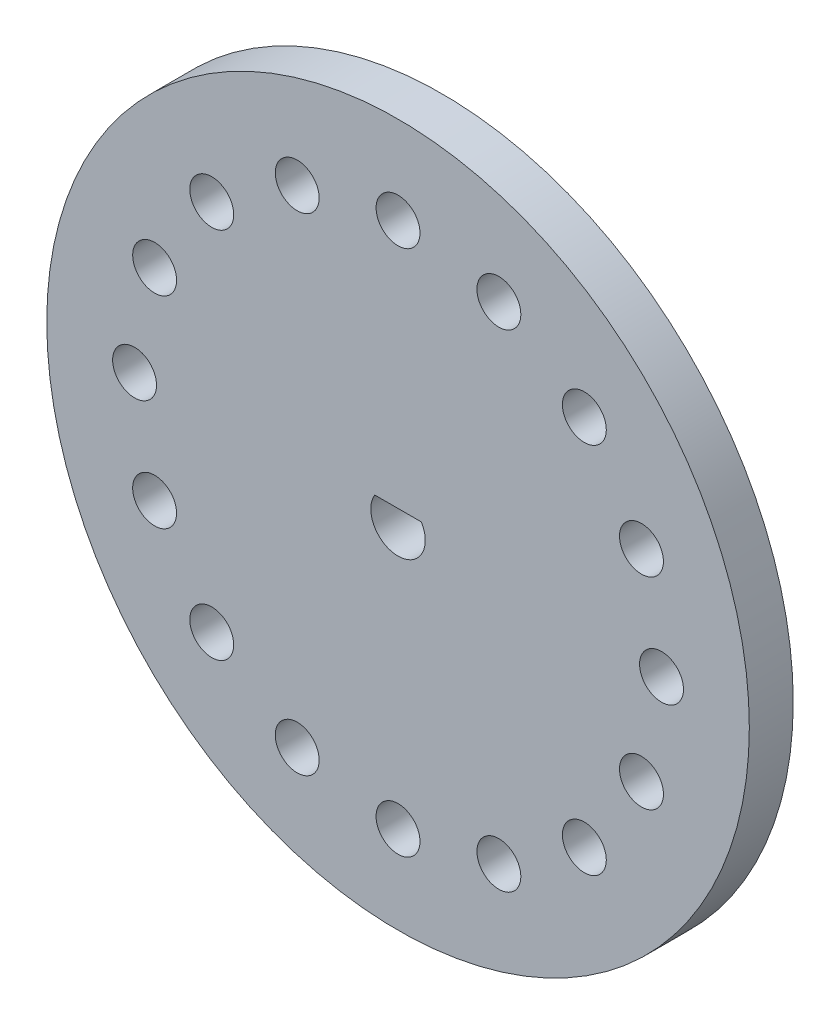
ISO-10303-21;
HEADER;
FILE_DESCRIPTION(('STEP AP214'),'2;1');
FILE_NAME('part.step','',(''),(''),'','','');
FILE_SCHEMA(('AUTOMOTIVE_DESIGN { 1 0 10303 214 1 1 1 1 }'));
ENDSEC;
DATA;
#1=APPLICATION_CONTEXT('core data for automotive mechanical design processes');
#2=APPLICATION_PROTOCOL_DEFINITION('international standard','automotive_design',2000,#1);
#3=PRODUCT_CONTEXT('',#1,'mechanical');
#4=PRODUCT('Part','Part','',(#3));
#5=PRODUCT_RELATED_PRODUCT_CATEGORY('part','',(#4));
#6=PRODUCT_DEFINITION_FORMATION('','',#4);
#7=PRODUCT_DEFINITION_CONTEXT('part definition',#1,'design');
#8=PRODUCT_DEFINITION('design','',#6,#7);
#9=PRODUCT_DEFINITION_SHAPE('','',#8);
#10=(LENGTH_UNIT() NAMED_UNIT(*) SI_UNIT(.MILLI.,.METRE.));
#11=(NAMED_UNIT(*) PLANE_ANGLE_UNIT() SI_UNIT($,.RADIAN.));
#12=(NAMED_UNIT(*) SI_UNIT($,.STERADIAN.) SOLID_ANGLE_UNIT());
#13=UNCERTAINTY_MEASURE_WITH_UNIT(LENGTH_MEASURE(1.E-05),#10,'distance_accuracy_value','');
#14=(GEOMETRIC_REPRESENTATION_CONTEXT(3) GLOBAL_UNCERTAINTY_ASSIGNED_CONTEXT((#13)) GLOBAL_UNIT_ASSIGNED_CONTEXT((#10,
#11,#12)) REPRESENTATION_CONTEXT('',''));
#15=CARTESIAN_POINT('',(0.,0.,0.));
#16=DIRECTION('',(0.,0.,1.));
#17=DIRECTION('',(1.,0.,0.));
#18=AXIS2_PLACEMENT_3D('',#15,#16,#17);
#19=CARTESIAN_POINT('',(0.,0.,-5.));
#20=DIRECTION('',(0.,0.,1.));
#21=DIRECTION('',(1.,0.,0.));
#22=AXIS2_PLACEMENT_3D('',#19,#20,#21);
#23=CYLINDRICAL_SURFACE('',#22,40.);
#24=CARTESIAN_POINT('',(0.,0.,-5.));
#25=DIRECTION('',(0.,0.,1.));
#26=DIRECTION('',(1.,0.,0.));
#27=AXIS2_PLACEMENT_3D('',#24,#25,#26);
#28=CIRCLE('',#27,40.);
#29=CARTESIAN_POINT('',(40.,0.,-5.));
#30=VERTEX_POINT('',#29);
#31=EDGE_CURVE('E11',#30,#30,#28,.T.);
#32=ORIENTED_EDGE('',*,*,#31,.T.);
#33=EDGE_LOOP('',(#32));
#34=FACE_BOUND('',#33,.T.);
#35=CARTESIAN_POINT('',(0.,0.,0.));
#36=DIRECTION('',(0.,0.,1.));
#37=DIRECTION('',(1.,0.,0.));
#38=AXIS2_PLACEMENT_3D('',#35,#36,#37);
#39=CIRCLE('',#38,40.);
#40=CARTESIAN_POINT('',(40.,0.,0.));
#41=VERTEX_POINT('',#40);
#42=EDGE_CURVE('E44',#41,#41,#39,.T.);
#43=ORIENTED_EDGE('',*,*,#42,.F.);
#44=EDGE_LOOP('',(#43));
#45=FACE_BOUND('',#44,.T.);
#46=ADVANCED_FACE('F41',(#34,#45),#23,.T.);
#47=CARTESIAN_POINT('',(0.,0.,-5.));
#48=DIRECTION('',(0.,0.,1.));
#49=DIRECTION('',(1.,0.,0.));
#50=AXIS2_PLACEMENT_3D('',#47,#48,#49);
#51=PLANE('',#50);
#52=CARTESIAN_POINT('',(-21.2132034355965,21.2132034355964,-5.));
#53=DIRECTION('',(0.,0.,1.));
#54=DIRECTION('',(1.,0.,0.));
#55=AXIS2_PLACEMENT_3D('',#52,#53,#54);
#56=CIRCLE('',#55,2.5);
#57=CARTESIAN_POINT('',(-18.7132034355965,21.2132034355964,-5.));
#58=VERTEX_POINT('',#57);
#59=EDGE_CURVE('E99',#58,#58,#56,.F.);
#60=ORIENTED_EDGE('',*,*,#59,.F.);
#61=EDGE_LOOP('',(#60));
#62=FACE_BOUND('',#61,.T.);
#63=CARTESIAN_POINT('',(-27.7163859753386,11.4805029709526,-5.));
#64=DIRECTION('',(0.,0.,1.));
#65=DIRECTION('',(1.,0.,0.));
#66=AXIS2_PLACEMENT_3D('',#63,#64,#65);
#67=CIRCLE('',#66,2.5);
#68=CARTESIAN_POINT('',(-25.2163859753386,11.4805029709526,-5.));
#69=VERTEX_POINT('',#68);
#70=EDGE_CURVE('E138',#69,#69,#67,.F.);
#71=ORIENTED_EDGE('',*,*,#70,.F.);
#72=EDGE_LOOP('',(#71));
#73=FACE_BOUND('',#72,.T.);
#74=CARTESIAN_POINT('',(-30.,-1.04744440165294E-13,-5.));
#75=DIRECTION('',(0.,0.,1.));
#76=DIRECTION('',(1.,0.,0.));
#77=AXIS2_PLACEMENT_3D('',#74,#75,#76);
#78=CIRCLE('',#77,2.5);
#79=CARTESIAN_POINT('',(-27.5,-1.04744440165294E-13,-5.));
#80=VERTEX_POINT('',#79);
#81=EDGE_CURVE('E132',#80,#80,#78,.F.);
#82=ORIENTED_EDGE('',*,*,#81,.F.);
#83=EDGE_LOOP('',(#82));
#84=FACE_BOUND('',#83,.T.);
#85=CARTESIAN_POINT('',(-27.7163859753386,-11.4805029709528,-5.));
#86=DIRECTION('',(0.,0.,1.));
#87=DIRECTION('',(1.,0.,0.));
#88=AXIS2_PLACEMENT_3D('',#85,#86,#87);
#89=CIRCLE('',#88,2.5);
#90=CARTESIAN_POINT('',(-25.2163859753386,-11.4805029709528,-5.));
#91=VERTEX_POINT('',#90);
#92=EDGE_CURVE('E126',#91,#91,#89,.F.);
#93=ORIENTED_EDGE('',*,*,#92,.F.);
#94=EDGE_LOOP('',(#93));
#95=FACE_BOUND('',#94,.T.);
#96=CARTESIAN_POINT('',(-21.2132034355963,-21.2132034355965,-5.));
#97=DIRECTION('',(0.,0.,1.));
#98=DIRECTION('',(1.,0.,0.));
#99=AXIS2_PLACEMENT_3D('',#96,#97,#98);
#100=CIRCLE('',#99,2.5);
#101=CARTESIAN_POINT('',(-18.7132034355963,-21.2132034355965,-5.));
#102=VERTEX_POINT('',#101);
#103=EDGE_CURVE('E120',#102,#102,#100,.F.);
#104=ORIENTED_EDGE('',*,*,#103,.F.);
#105=EDGE_LOOP('',(#104));
#106=FACE_BOUND('',#105,.T.);
#107=CARTESIAN_POINT('',(-11.4805029709525,-27.7163859753387,-5.));
#108=DIRECTION('',(0.,0.,1.));
#109=DIRECTION('',(1.,0.,0.));
#110=AXIS2_PLACEMENT_3D('',#107,#108,#109);
#111=CIRCLE('',#110,2.5);
#112=CARTESIAN_POINT('',(-8.98050297095252,-27.7163859753387,-5.));
#113=VERTEX_POINT('',#112);
#114=EDGE_CURVE('E114',#113,#113,#111,.F.);
#115=ORIENTED_EDGE('',*,*,#114,.F.);
#116=EDGE_LOOP('',(#115));
#117=FACE_BOUND('',#116,.T.);
#118=CARTESIAN_POINT('',(0.,-30.,-5.));
#119=DIRECTION('',(0.,0.,1.));
#120=DIRECTION('',(1.,0.,0.));
#121=AXIS2_PLACEMENT_3D('',#118,#119,#120);
#122=CIRCLE('',#121,2.5);
#123=CARTESIAN_POINT('',(2.5,-30.,-5.));
#124=VERTEX_POINT('',#123);
#125=EDGE_CURVE('E108',#124,#124,#122,.F.);
#126=ORIENTED_EDGE('',*,*,#125,.F.);
#127=EDGE_LOOP('',(#126));
#128=FACE_BOUND('',#127,.T.);
#129=CARTESIAN_POINT('',(11.4805029709529,-27.7163859753385,-5.));
#130=DIRECTION('',(0.,0.,1.));
#131=DIRECTION('',(1.,0.,0.));
#132=AXIS2_PLACEMENT_3D('',#129,#130,#131);
#133=CIRCLE('',#132,2.5);
#134=CARTESIAN_POINT('',(13.9805029709529,-27.7163859753385,-5.));
#135=VERTEX_POINT('',#134);
#136=EDGE_CURVE('E100',#135,#135,#133,.F.);
#137=ORIENTED_EDGE('',*,*,#136,.F.);
#138=EDGE_LOOP('',(#137));
#139=FACE_BOUND('',#138,.T.);
#140=CARTESIAN_POINT('',(21.2132034355966,-21.2132034355962,-5.));
#141=DIRECTION('',(0.,0.,1.));
#142=DIRECTION('',(1.,0.,0.));
#143=AXIS2_PLACEMENT_3D('',#140,#141,#142);
#144=CIRCLE('',#143,2.5);
#145=CARTESIAN_POINT('',(23.7132034355966,-21.2132034355962,-5.));
#146=VERTEX_POINT('',#145);
#147=EDGE_CURVE('E107',#146,#146,#144,.F.);
#148=ORIENTED_EDGE('',*,*,#147,.F.);
#149=EDGE_LOOP('',(#148));
#150=FACE_BOUND('',#149,.T.);
#151=CARTESIAN_POINT('',(27.7163859753387,-11.4805029709524,-5.));
#152=DIRECTION('',(0.,0.,1.));
#153=DIRECTION('',(1.,0.,0.));
#154=AXIS2_PLACEMENT_3D('',#151,#152,#153);
#155=CIRCLE('',#154,2.5);
#156=CARTESIAN_POINT('',(30.2163859753387,-11.4805029709524,-5.));
#157=VERTEX_POINT('',#156);
#158=EDGE_CURVE('E173',#157,#157,#155,.F.);
#159=ORIENTED_EDGE('',*,*,#158,.F.);
#160=EDGE_LOOP('',(#159));
#161=FACE_BOUND('',#160,.T.);
#162=CARTESIAN_POINT('',(30.,3.14233320495882E-13,-5.));
#163=DIRECTION('',(0.,0.,1.));
#164=DIRECTION('',(1.,0.,0.));
#165=AXIS2_PLACEMENT_3D('',#162,#163,#164);
#166=CIRCLE('',#165,2.5);
#167=CARTESIAN_POINT('',(32.5,3.14233320495882E-13,-5.));
#168=VERTEX_POINT('',#167);
#169=EDGE_CURVE('E167',#168,#168,#166,.F.);
#170=ORIENTED_EDGE('',*,*,#169,.F.);
#171=EDGE_LOOP('',(#170));
#172=FACE_BOUND('',#171,.T.);
#173=CARTESIAN_POINT('',(27.7163859753385,11.480502970953,-5.));
#174=DIRECTION('',(0.,0.,1.));
#175=DIRECTION('',(1.,0.,0.));
#176=AXIS2_PLACEMENT_3D('',#173,#174,#175);
#177=CIRCLE('',#176,2.5);
#178=CARTESIAN_POINT('',(30.2163859753385,11.480502970953,-5.));
#179=VERTEX_POINT('',#178);
#180=EDGE_CURVE('E161',#179,#179,#177,.F.);
#181=ORIENTED_EDGE('',*,*,#180,.F.);
#182=EDGE_LOOP('',(#181));
#183=FACE_BOUND('',#182,.T.);
#184=CARTESIAN_POINT('',(21.2132034355962,21.2132034355967,-5.));
#185=DIRECTION('',(0.,0.,1.));
#186=DIRECTION('',(1.,0.,0.));
#187=AXIS2_PLACEMENT_3D('',#184,#185,#186);
#188=CIRCLE('',#187,2.5);
#189=CARTESIAN_POINT('',(23.7132034355962,21.2132034355967,-5.));
#190=VERTEX_POINT('',#189);
#191=EDGE_CURVE('E155',#190,#190,#188,.F.);
#192=ORIENTED_EDGE('',*,*,#191,.F.);
#193=EDGE_LOOP('',(#192));
#194=FACE_BOUND('',#193,.T.);
#195=CARTESIAN_POINT('',(11.4805029709523,27.7163859753388,-5.));
#196=DIRECTION('',(0.,0.,1.));
#197=DIRECTION('',(1.,0.,0.));
#198=AXIS2_PLACEMENT_3D('',#195,#196,#197);
#199=CIRCLE('',#198,2.5);
#200=CARTESIAN_POINT('',(13.9805029709523,27.7163859753388,-5.));
#201=VERTEX_POINT('',#200);
#202=EDGE_CURVE('E148',#201,#201,#199,.F.);
#203=ORIENTED_EDGE('',*,*,#202,.F.);
#204=EDGE_LOOP('',(#203));
#205=FACE_BOUND('',#204,.T.);
#206=CARTESIAN_POINT('',(-11.4805029709527,27.7163859753386,-5.));
#207=DIRECTION('',(0.,0.,1.));
#208=DIRECTION('',(1.,0.,0.));
#209=AXIS2_PLACEMENT_3D('',#206,#207,#208);
#210=CIRCLE('',#209,2.5);
#211=CARTESIAN_POINT('',(-8.98050297095272,27.7163859753386,-5.));
#212=VERTEX_POINT('',#211);
#213=EDGE_CURVE('E93',#212,#212,#210,.F.);
#214=ORIENTED_EDGE('',*,*,#213,.F.);
#215=EDGE_LOOP('',(#214));
#216=FACE_BOUND('',#215,.T.);
#217=CARTESIAN_POINT('',(0.,30.,-5.));
#218=DIRECTION('',(0.,0.,1.));
#219=DIRECTION('',(1.,0.,0.));
#220=AXIS2_PLACEMENT_3D('',#217,#218,#219);
#221=CIRCLE('',#220,2.5);
#222=CARTESIAN_POINT('',(2.5,30.,-5.));
#223=VERTEX_POINT('',#222);
#224=EDGE_CURVE('E80',#223,#223,#221,.F.);
#225=ORIENTED_EDGE('',*,*,#224,.F.);
#226=EDGE_LOOP('',(#225));
#227=FACE_BOUND('',#226,.T.);
#228=DIRECTION('',(-1.,0.,0.));
#229=VECTOR('',#228,1.);
#230=CARTESIAN_POINT('',(2.65518360947035,1.6,-5.));
#231=LINE('',#230,#229);
#232=CARTESIAN_POINT('',(2.65518360947035,1.6,-5.));
#233=VERTEX_POINT('',#232);
#234=CARTESIAN_POINT('',(-2.65518360947035,1.6,-5.));
#235=VERTEX_POINT('',#234);
#236=EDGE_CURVE('E86',#233,#235,#231,.T.);
#237=ORIENTED_EDGE('',*,*,#236,.T.);
#238=CARTESIAN_POINT('',(0.,0.,-5.));
#239=DIRECTION('',(0.,0.,1.));
#240=DIRECTION('',(1.,0.,0.));
#241=AXIS2_PLACEMENT_3D('',#238,#239,#240);
#242=CIRCLE('',#241,3.1);
#243=EDGE_CURVE('E55',#235,#233,#242,.T.);
#244=ORIENTED_EDGE('',*,*,#243,.T.);
#245=EDGE_LOOP('',(#237,#244));
#246=FACE_BOUND('',#245,.T.);
#247=ORIENTED_EDGE('',*,*,#31,.F.);
#248=EDGE_LOOP('',(#247));
#249=FACE_BOUND('',#248,.T.);
#250=ADVANCED_FACE('F189',(#62,#73,#84,#95,#106,#117,#128,#139,#150,#161,#172,#183,#194,#205,
#216,#227,#246,#249),#51,.F.);
#251=CARTESIAN_POINT('',(0.,0.,0.));
#252=DIRECTION('',(0.,0.,1.));
#253=DIRECTION('',(1.,0.,0.));
#254=AXIS2_PLACEMENT_3D('',#251,#252,#253);
#255=PLANE('',#254);
#256=CARTESIAN_POINT('',(-21.2132034355965,21.2132034355964,0.));
#257=DIRECTION('',(0.,0.,1.));
#258=DIRECTION('',(0.707106781186546,0.707106781186549,0.));
#259=AXIS2_PLACEMENT_3D('',#256,#257,#258);
#260=CIRCLE('',#259,2.5);
#261=CARTESIAN_POINT('',(-19.4454364826301,22.9809703885628,0.));
#262=VERTEX_POINT('',#261);
#263=EDGE_CURVE('E141',#262,#262,#260,.T.);
#264=ORIENTED_EDGE('',*,*,#263,.F.);
#265=EDGE_LOOP('',(#264));
#266=FACE_BOUND('',#265,.T.);
#267=CARTESIAN_POINT('',(-27.7163859753386,11.4805029709526,0.));
#268=DIRECTION('',(0.,0.,1.));
#269=DIRECTION('',(0.382683432365087,0.923879532511288,0.));
#270=AXIS2_PLACEMENT_3D('',#267,#268,#269);
#271=CIRCLE('',#270,2.5);
#272=CARTESIAN_POINT('',(-26.7596773944259,13.7902018022308,0.));
#273=VERTEX_POINT('',#272);
#274=EDGE_CURVE('E135',#273,#273,#271,.T.);
#275=ORIENTED_EDGE('',*,*,#274,.F.);
#276=EDGE_LOOP('',(#275));
#277=FACE_BOUND('',#276,.T.);
#278=CARTESIAN_POINT('',(-30.,-1.04744440165294E-13,0.));
#279=DIRECTION('',(0.,0.,1.));
#280=DIRECTION('',(0.,1.,0.));
#281=AXIS2_PLACEMENT_3D('',#278,#279,#280);
#282=CIRCLE('',#281,2.5);
#283=CARTESIAN_POINT('',(-30.,2.4999999999999,0.));
#284=VERTEX_POINT('',#283);
#285=EDGE_CURVE('E129',#284,#284,#282,.T.);
#286=ORIENTED_EDGE('',*,*,#285,.F.);
#287=EDGE_LOOP('',(#286));
#288=FACE_BOUND('',#287,.T.);
#289=CARTESIAN_POINT('',(-27.7163859753386,-11.4805029709528,0.));
#290=DIRECTION('',(0.,0.,1.));
#291=DIRECTION('',(-0.382683432365094,0.923879532511285,0.));
#292=AXIS2_PLACEMENT_3D('',#289,#290,#291);
#293=CIRCLE('',#292,2.5);
#294=CARTESIAN_POINT('',(-28.6730945562513,-9.1708041396746,0.));
#295=VERTEX_POINT('',#294);
#296=EDGE_CURVE('E123',#295,#295,#293,.T.);
#297=ORIENTED_EDGE('',*,*,#296,.F.);
#298=EDGE_LOOP('',(#297));
#299=FACE_BOUND('',#298,.T.);
#300=CARTESIAN_POINT('',(-21.2132034355963,-21.2132034355965,0.));
#301=DIRECTION('',(0.,0.,1.));
#302=DIRECTION('',(-0.707106781186551,0.707106781186544,0.));
#303=AXIS2_PLACEMENT_3D('',#300,#301,#302);
#304=CIRCLE('',#303,2.5);
#305=CARTESIAN_POINT('',(-22.9809703885627,-19.4454364826302,0.));
#306=VERTEX_POINT('',#305);
#307=EDGE_CURVE('E117',#306,#306,#304,.T.);
#308=ORIENTED_EDGE('',*,*,#307,.F.);
#309=EDGE_LOOP('',(#308));
#310=FACE_BOUND('',#309,.T.);
#311=CARTESIAN_POINT('',(-11.4805029709525,-27.7163859753387,0.));
#312=DIRECTION('',(0.,0.,1.));
#313=DIRECTION('',(-0.923879532511289,0.382683432365084,0.));
#314=AXIS2_PLACEMENT_3D('',#311,#312,#313);
#315=CIRCLE('',#314,2.5);
#316=CARTESIAN_POINT('',(-13.7902018022307,-26.759677394426,0.));
#317=VERTEX_POINT('',#316);
#318=EDGE_CURVE('E111',#317,#317,#315,.T.);
#319=ORIENTED_EDGE('',*,*,#318,.F.);
#320=EDGE_LOOP('',(#319));
#321=FACE_BOUND('',#320,.T.);
#322=CARTESIAN_POINT('',(0.,-30.,0.));
#323=DIRECTION('',(0.,0.,1.));
#324=DIRECTION('',(-1.,0.,0.));
#325=AXIS2_PLACEMENT_3D('',#322,#323,#324);
#326=CIRCLE('',#325,2.5);
#327=CARTESIAN_POINT('',(-2.5,-30.,0.));
#328=VERTEX_POINT('',#327);
#329=EDGE_CURVE('E103',#328,#328,#326,.T.);
#330=ORIENTED_EDGE('',*,*,#329,.F.);
#331=EDGE_LOOP('',(#330));
#332=FACE_BOUND('',#331,.T.);
#333=CARTESIAN_POINT('',(11.4805029709529,-27.7163859753385,0.));
#334=DIRECTION('',(0.,0.,1.));
#335=DIRECTION('',(-0.923879532511284,-0.382683432365097,0.));
#336=AXIS2_PLACEMENT_3D('',#333,#334,#335);
#337=CIRCLE('',#336,2.5);
#338=CARTESIAN_POINT('',(9.1708041396747,-28.6730945562513,0.));
#339=VERTEX_POINT('',#338);
#340=EDGE_CURVE('E104',#339,#339,#337,.T.);
#341=ORIENTED_EDGE('',*,*,#340,.F.);
#342=EDGE_LOOP('',(#341));
#343=FACE_BOUND('',#342,.T.);
#344=CARTESIAN_POINT('',(21.2132034355966,-21.2132034355962,0.));
#345=DIRECTION('',(0.,0.,1.));
#346=DIRECTION('',(-0.707106781186541,-0.707106781186554,0.));
#347=AXIS2_PLACEMENT_3D('',#344,#345,#346);
#348=CIRCLE('',#347,2.5);
#349=CARTESIAN_POINT('',(19.4454364826303,-22.9809703885626,0.));
#350=VERTEX_POINT('',#349);
#351=EDGE_CURVE('E176',#350,#350,#348,.T.);
#352=ORIENTED_EDGE('',*,*,#351,.F.);
#353=EDGE_LOOP('',(#352));
#354=FACE_BOUND('',#353,.T.);
#355=CARTESIAN_POINT('',(27.7163859753387,-11.4805029709524,0.));
#356=DIRECTION('',(0.,0.,1.));
#357=DIRECTION('',(-0.382683432365081,-0.923879532511291,0.));
#358=AXIS2_PLACEMENT_3D('',#355,#356,#357);
#359=CIRCLE('',#358,2.5);
#360=CARTESIAN_POINT('',(26.759677394426,-13.7902018022306,0.));
#361=VERTEX_POINT('',#360);
#362=EDGE_CURVE('E170',#361,#361,#359,.T.);
#363=ORIENTED_EDGE('',*,*,#362,.F.);
#364=EDGE_LOOP('',(#363));
#365=FACE_BOUND('',#364,.T.);
#366=CARTESIAN_POINT('',(30.,3.14233320495882E-13,0.));
#367=DIRECTION('',(0.,0.,1.));
#368=DIRECTION('',(0.,-1.,0.));
#369=AXIS2_PLACEMENT_3D('',#366,#367,#368);
#370=CIRCLE('',#369,2.5);
#371=CARTESIAN_POINT('',(30.,-2.49999999999969,0.));
#372=VERTEX_POINT('',#371);
#373=EDGE_CURVE('E164',#372,#372,#370,.T.);
#374=ORIENTED_EDGE('',*,*,#373,.F.);
#375=EDGE_LOOP('',(#374));
#376=FACE_BOUND('',#375,.T.);
#377=CARTESIAN_POINT('',(27.7163859753385,11.480502970953,0.));
#378=DIRECTION('',(0.,0.,1.));
#379=DIRECTION('',(0.3826834323651,-0.923879532511283,0.));
#380=AXIS2_PLACEMENT_3D('',#377,#378,#379);
#381=CIRCLE('',#380,2.5);
#382=CARTESIAN_POINT('',(28.6730945562512,9.17080413967479,0.));
#383=VERTEX_POINT('',#382);
#384=EDGE_CURVE('E158',#383,#383,#381,.T.);
#385=ORIENTED_EDGE('',*,*,#384,.F.);
#386=EDGE_LOOP('',(#385));
#387=FACE_BOUND('',#386,.T.);
#388=CARTESIAN_POINT('',(21.2132034355962,21.2132034355967,0.));
#389=DIRECTION('',(0.,0.,1.));
#390=DIRECTION('',(0.707106781186556,-0.707106781186539,0.));
#391=AXIS2_PLACEMENT_3D('',#388,#389,#390);
#392=CIRCLE('',#391,2.5);
#393=CARTESIAN_POINT('',(22.9809703885626,19.4454364826303,0.));
#394=VERTEX_POINT('',#393);
#395=EDGE_CURVE('E151',#394,#394,#392,.T.);
#396=ORIENTED_EDGE('',*,*,#395,.F.);
#397=EDGE_LOOP('',(#396));
#398=FACE_BOUND('',#397,.T.);
#399=CARTESIAN_POINT('',(11.4805029709523,27.7163859753388,0.));
#400=DIRECTION('',(0.,0.,1.));
#401=DIRECTION('',(0.923879532511292,-0.382683432365077,0.));
#402=AXIS2_PLACEMENT_3D('',#399,#400,#401);
#403=CIRCLE('',#402,2.5);
#404=CARTESIAN_POINT('',(13.7902018022306,26.7596773944261,0.));
#405=VERTEX_POINT('',#404);
#406=EDGE_CURVE('E152',#405,#405,#403,.T.);
#407=ORIENTED_EDGE('',*,*,#406,.F.);
#408=EDGE_LOOP('',(#407));
#409=FACE_BOUND('',#408,.T.);
#410=CARTESIAN_POINT('',(-11.4805029709527,27.7163859753386,0.));
#411=DIRECTION('',(0.,0.,1.));
#412=DIRECTION('',(0.923879532511287,0.382683432365091,0.));
#413=AXIS2_PLACEMENT_3D('',#410,#411,#412);
#414=CIRCLE('',#413,2.5);
#415=CARTESIAN_POINT('',(-9.1708041396745,28.6730945562513,0.));
#416=VERTEX_POINT('',#415);
#417=EDGE_CURVE('E96',#416,#416,#414,.T.);
#418=ORIENTED_EDGE('',*,*,#417,.F.);
#419=EDGE_LOOP('',(#418));
#420=FACE_BOUND('',#419,.T.);
#421=CARTESIAN_POINT('',(0.,30.,0.));
#422=DIRECTION('',(0.,0.,1.));
#423=DIRECTION('',(1.,0.,0.));
#424=AXIS2_PLACEMENT_3D('',#421,#422,#423);
#425=CIRCLE('',#424,2.5);
#426=CARTESIAN_POINT('',(2.5,30.,0.));
#427=VERTEX_POINT('',#426);
#428=EDGE_CURVE('E83',#427,#427,#425,.T.);
#429=ORIENTED_EDGE('',*,*,#428,.F.);
#430=EDGE_LOOP('',(#429));
#431=FACE_BOUND('',#430,.T.);
#432=CARTESIAN_POINT('',(0.,0.,0.));
#433=DIRECTION('',(0.,0.,1.));
#434=DIRECTION('',(1.,0.,0.));
#435=AXIS2_PLACEMENT_3D('',#432,#433,#434);
#436=CIRCLE('',#435,3.1);
#437=CARTESIAN_POINT('',(-2.65518360947035,1.6,0.));
#438=VERTEX_POINT('',#437);
#439=CARTESIAN_POINT('',(2.65518360947035,1.6,0.));
#440=VERTEX_POINT('',#439);
#441=EDGE_CURVE('E60',#438,#440,#436,.T.);
#442=ORIENTED_EDGE('',*,*,#441,.F.);
#443=DIRECTION('',(-1.,0.,0.));
#444=VECTOR('',#443,1.);
#445=CARTESIAN_POINT('',(2.65518360947035,1.6,0.));
#446=LINE('',#445,#444);
#447=EDGE_CURVE('E74',#440,#438,#446,.T.);
#448=ORIENTED_EDGE('',*,*,#447,.F.);
#449=EDGE_LOOP('',(#442,#448));
#450=FACE_BOUND('',#449,.T.);
#451=ORIENTED_EDGE('',*,*,#42,.T.);
#452=EDGE_LOOP('',(#451));
#453=FACE_BOUND('',#452,.T.);
#454=ADVANCED_FACE('F78',(#266,#277,#288,#299,#310,#321,#332,#343,#354,#365,#376,#387,#398,#409,
#420,#431,#450,#453),#255,.T.);
#455=CARTESIAN_POINT('',(0.,0.,-5.));
#456=DIRECTION('',(0.,0.,1.));
#457=DIRECTION('',(1.,0.,0.));
#458=AXIS2_PLACEMENT_3D('',#455,#456,#457);
#459=CYLINDRICAL_SURFACE('',#458,3.1);
#460=ORIENTED_EDGE('',*,*,#441,.T.);
#461=DIRECTION('',(0.,0.,1.));
#462=VECTOR('',#461,1.);
#463=CARTESIAN_POINT('',(2.65518360947035,1.6,-5.));
#464=LINE('',#463,#462);
#465=EDGE_CURVE('E71',#233,#440,#464,.T.);
#466=ORIENTED_EDGE('',*,*,#465,.F.);
#467=ORIENTED_EDGE('',*,*,#243,.F.);
#468=DIRECTION('',(0.,0.,1.));
#469=VECTOR('',#468,1.);
#470=CARTESIAN_POINT('',(-2.65518360947035,1.6,-5.));
#471=LINE('',#470,#469);
#472=EDGE_CURVE('E65',#235,#438,#471,.T.);
#473=ORIENTED_EDGE('',*,*,#472,.T.);
#474=EDGE_LOOP('',(#460,#466,#467,#473));
#475=FACE_BOUND('',#474,.T.);
#476=ADVANCED_FACE('F67',(#475),#459,.F.);
#477=CARTESIAN_POINT('',(2.65518360947035,1.6,-5.));
#478=DIRECTION('',(0.,1.,0.));
#479=DIRECTION('',(0.,0.,1.));
#480=AXIS2_PLACEMENT_3D('',#477,#478,#479);
#481=PLANE('',#480);
#482=ORIENTED_EDGE('',*,*,#447,.T.);
#483=ORIENTED_EDGE('',*,*,#472,.F.);
#484=ORIENTED_EDGE('',*,*,#236,.F.);
#485=ORIENTED_EDGE('',*,*,#465,.T.);
#486=EDGE_LOOP('',(#482,#483,#484,#485));
#487=FACE_BOUND('',#486,.T.);
#488=ADVANCED_FACE('F75',(#487),#481,.F.);
#489=CARTESIAN_POINT('',(0.,30.,-5.001));
#490=DIRECTION('',(0.,0.,1.));
#491=DIRECTION('',(1.,0.,0.));
#492=AXIS2_PLACEMENT_3D('',#489,#490,#491);
#493=CYLINDRICAL_SURFACE('',#492,2.5);
#494=ORIENTED_EDGE('',*,*,#428,.T.);
#495=EDGE_LOOP('',(#494));
#496=FACE_BOUND('',#495,.T.);
#497=ORIENTED_EDGE('',*,*,#224,.T.);
#498=EDGE_LOOP('',(#497));
#499=FACE_BOUND('',#498,.T.);
#500=ADVANCED_FACE('F205',(#496,#499),#493,.F.);
#501=CARTESIAN_POINT('',(-11.4805029709527,27.7163859753386,-5.001));
#502=DIRECTION('',(0.,0.,1.));
#503=DIRECTION('',(1.,0.,0.));
#504=AXIS2_PLACEMENT_3D('',#501,#502,#503);
#505=CYLINDRICAL_SURFACE('',#504,2.5);
#506=ORIENTED_EDGE('',*,*,#417,.T.);
#507=EDGE_LOOP('',(#506));
#508=FACE_BOUND('',#507,.T.);
#509=ORIENTED_EDGE('',*,*,#213,.T.);
#510=EDGE_LOOP('',(#509));
#511=FACE_BOUND('',#510,.T.);
#512=ADVANCED_FACE('F208',(#508,#511),#505,.F.);
#513=CARTESIAN_POINT('',(11.4805029709523,27.7163859753388,-5.001));
#514=DIRECTION('',(0.,0.,1.));
#515=DIRECTION('',(1.,0.,0.));
#516=AXIS2_PLACEMENT_3D('',#513,#514,#515);
#517=CYLINDRICAL_SURFACE('',#516,2.5);
#518=ORIENTED_EDGE('',*,*,#406,.T.);
#519=EDGE_LOOP('',(#518));
#520=FACE_BOUND('',#519,.T.);
#521=ORIENTED_EDGE('',*,*,#202,.T.);
#522=EDGE_LOOP('',(#521));
#523=FACE_BOUND('',#522,.T.);
#524=ADVANCED_FACE('F254',(#520,#523),#517,.F.);
#525=CARTESIAN_POINT('',(21.2132034355962,21.2132034355967,-5.001));
#526=DIRECTION('',(0.,0.,1.));
#527=DIRECTION('',(1.,0.,0.));
#528=AXIS2_PLACEMENT_3D('',#525,#526,#527);
#529=CYLINDRICAL_SURFACE('',#528,2.5);
#530=ORIENTED_EDGE('',*,*,#395,.T.);
#531=EDGE_LOOP('',(#530));
#532=FACE_BOUND('',#531,.T.);
#533=ORIENTED_EDGE('',*,*,#191,.T.);
#534=EDGE_LOOP('',(#533));
#535=FACE_BOUND('',#534,.T.);
#536=ADVANCED_FACE('F262',(#532,#535),#529,.F.);
#537=CARTESIAN_POINT('',(27.7163859753385,11.480502970953,-5.001));
#538=DIRECTION('',(0.,0.,1.));
#539=DIRECTION('',(1.,0.,0.));
#540=AXIS2_PLACEMENT_3D('',#537,#538,#539);
#541=CYLINDRICAL_SURFACE('',#540,2.5);
#542=ORIENTED_EDGE('',*,*,#384,.T.);
#543=EDGE_LOOP('',(#542));
#544=FACE_BOUND('',#543,.T.);
#545=ORIENTED_EDGE('',*,*,#180,.T.);
#546=EDGE_LOOP('',(#545));
#547=FACE_BOUND('',#546,.T.);
#548=ADVANCED_FACE('F270',(#544,#547),#541,.F.);
#549=CARTESIAN_POINT('',(30.,3.14233320495882E-13,-5.001));
#550=DIRECTION('',(0.,0.,1.));
#551=DIRECTION('',(1.,0.,0.));
#552=AXIS2_PLACEMENT_3D('',#549,#550,#551);
#553=CYLINDRICAL_SURFACE('',#552,2.5);
#554=ORIENTED_EDGE('',*,*,#373,.T.);
#555=EDGE_LOOP('',(#554));
#556=FACE_BOUND('',#555,.T.);
#557=ORIENTED_EDGE('',*,*,#169,.T.);
#558=EDGE_LOOP('',(#557));
#559=FACE_BOUND('',#558,.T.);
#560=ADVANCED_FACE('F278',(#556,#559),#553,.F.);
#561=CARTESIAN_POINT('',(27.7163859753387,-11.4805029709524,-5.001));
#562=DIRECTION('',(0.,0.,1.));
#563=DIRECTION('',(1.,0.,0.));
#564=AXIS2_PLACEMENT_3D('',#561,#562,#563);
#565=CYLINDRICAL_SURFACE('',#564,2.5);
#566=ORIENTED_EDGE('',*,*,#362,.T.);
#567=EDGE_LOOP('',(#566));
#568=FACE_BOUND('',#567,.T.);
#569=ORIENTED_EDGE('',*,*,#158,.T.);
#570=EDGE_LOOP('',(#569));
#571=FACE_BOUND('',#570,.T.);
#572=ADVANCED_FACE('F286',(#568,#571),#565,.F.);
#573=CARTESIAN_POINT('',(21.2132034355966,-21.2132034355962,-5.001));
#574=DIRECTION('',(0.,0.,1.));
#575=DIRECTION('',(1.,0.,0.));
#576=AXIS2_PLACEMENT_3D('',#573,#574,#575);
#577=CYLINDRICAL_SURFACE('',#576,2.5);
#578=ORIENTED_EDGE('',*,*,#351,.T.);
#579=EDGE_LOOP('',(#578));
#580=FACE_BOUND('',#579,.T.);
#581=ORIENTED_EDGE('',*,*,#147,.T.);
#582=EDGE_LOOP('',(#581));
#583=FACE_BOUND('',#582,.T.);
#584=ADVANCED_FACE('F184',(#580,#583),#577,.F.);
#585=CARTESIAN_POINT('',(11.4805029709529,-27.7163859753385,-5.001));
#586=DIRECTION('',(0.,0.,1.));
#587=DIRECTION('',(1.,0.,0.));
#588=AXIS2_PLACEMENT_3D('',#585,#586,#587);
#589=CYLINDRICAL_SURFACE('',#588,2.5);
#590=ORIENTED_EDGE('',*,*,#340,.T.);
#591=EDGE_LOOP('',(#590));
#592=FACE_BOUND('',#591,.T.);
#593=ORIENTED_EDGE('',*,*,#136,.T.);
#594=EDGE_LOOP('',(#593));
#595=FACE_BOUND('',#594,.T.);
#596=ADVANCED_FACE('F301',(#592,#595),#589,.F.);
#597=CARTESIAN_POINT('',(0.,-30.,-5.001));
#598=DIRECTION('',(0.,0.,1.));
#599=DIRECTION('',(1.,0.,0.));
#600=AXIS2_PLACEMENT_3D('',#597,#598,#599);
#601=CYLINDRICAL_SURFACE('',#600,2.5);
#602=ORIENTED_EDGE('',*,*,#329,.T.);
#603=EDGE_LOOP('',(#602));
#604=FACE_BOUND('',#603,.T.);
#605=ORIENTED_EDGE('',*,*,#125,.T.);
#606=EDGE_LOOP('',(#605));
#607=FACE_BOUND('',#606,.T.);
#608=ADVANCED_FACE('F308',(#604,#607),#601,.F.);
#609=CARTESIAN_POINT('',(-11.4805029709525,-27.7163859753387,-5.001));
#610=DIRECTION('',(0.,0.,1.));
#611=DIRECTION('',(1.,0.,0.));
#612=AXIS2_PLACEMENT_3D('',#609,#610,#611);
#613=CYLINDRICAL_SURFACE('',#612,2.5);
#614=ORIENTED_EDGE('',*,*,#318,.T.);
#615=EDGE_LOOP('',(#614));
#616=FACE_BOUND('',#615,.T.);
#617=ORIENTED_EDGE('',*,*,#114,.T.);
#618=EDGE_LOOP('',(#617));
#619=FACE_BOUND('',#618,.T.);
#620=ADVANCED_FACE('F316',(#616,#619),#613,.F.);
#621=CARTESIAN_POINT('',(-21.2132034355963,-21.2132034355965,-5.001));
#622=DIRECTION('',(0.,0.,1.));
#623=DIRECTION('',(1.,0.,0.));
#624=AXIS2_PLACEMENT_3D('',#621,#622,#623);
#625=CYLINDRICAL_SURFACE('',#624,2.5);
#626=ORIENTED_EDGE('',*,*,#307,.T.);
#627=EDGE_LOOP('',(#626));
#628=FACE_BOUND('',#627,.T.);
#629=ORIENTED_EDGE('',*,*,#103,.T.);
#630=EDGE_LOOP('',(#629));
#631=FACE_BOUND('',#630,.T.);
#632=ADVANCED_FACE('F324',(#628,#631),#625,.F.);
#633=CARTESIAN_POINT('',(-27.7163859753386,-11.4805029709528,-5.001));
#634=DIRECTION('',(0.,0.,1.));
#635=DIRECTION('',(1.,0.,0.));
#636=AXIS2_PLACEMENT_3D('',#633,#634,#635);
#637=CYLINDRICAL_SURFACE('',#636,2.5);
#638=ORIENTED_EDGE('',*,*,#296,.T.);
#639=EDGE_LOOP('',(#638));
#640=FACE_BOUND('',#639,.T.);
#641=ORIENTED_EDGE('',*,*,#92,.T.);
#642=EDGE_LOOP('',(#641));
#643=FACE_BOUND('',#642,.T.);
#644=ADVANCED_FACE('F332',(#640,#643),#637,.F.);
#645=CARTESIAN_POINT('',(-30.,-1.04744440165294E-13,-5.001));
#646=DIRECTION('',(0.,0.,1.));
#647=DIRECTION('',(1.,0.,0.));
#648=AXIS2_PLACEMENT_3D('',#645,#646,#647);
#649=CYLINDRICAL_SURFACE('',#648,2.5);
#650=ORIENTED_EDGE('',*,*,#285,.T.);
#651=EDGE_LOOP('',(#650));
#652=FACE_BOUND('',#651,.T.);
#653=ORIENTED_EDGE('',*,*,#81,.T.);
#654=EDGE_LOOP('',(#653));
#655=FACE_BOUND('',#654,.T.);
#656=ADVANCED_FACE('F340',(#652,#655),#649,.F.);
#657=CARTESIAN_POINT('',(-27.7163859753386,11.4805029709526,-5.001));
#658=DIRECTION('',(0.,0.,1.));
#659=DIRECTION('',(1.,0.,0.));
#660=AXIS2_PLACEMENT_3D('',#657,#658,#659);
#661=CYLINDRICAL_SURFACE('',#660,2.5);
#662=ORIENTED_EDGE('',*,*,#274,.T.);
#663=EDGE_LOOP('',(#662));
#664=FACE_BOUND('',#663,.T.);
#665=ORIENTED_EDGE('',*,*,#70,.T.);
#666=EDGE_LOOP('',(#665));
#667=FACE_BOUND('',#666,.T.);
#668=ADVANCED_FACE('F348',(#664,#667),#661,.F.);
#669=CARTESIAN_POINT('',(-21.2132034355965,21.2132034355964,-5.001));
#670=DIRECTION('',(0.,0.,1.));
#671=DIRECTION('',(1.,0.,0.));
#672=AXIS2_PLACEMENT_3D('',#669,#670,#671);
#673=CYLINDRICAL_SURFACE('',#672,2.5);
#674=ORIENTED_EDGE('',*,*,#263,.T.);
#675=EDGE_LOOP('',(#674));
#676=FACE_BOUND('',#675,.T.);
#677=ORIENTED_EDGE('',*,*,#59,.T.);
#678=EDGE_LOOP('',(#677));
#679=FACE_BOUND('',#678,.T.);
#680=ADVANCED_FACE('F356',(#676,#679),#673,.F.);
#681=CLOSED_SHELL('',(#46,#250,#454,#476,#488,#500,#512,#524,#536,#548,#560,#572,#584,#596,#608,
#620,#632,#644,#656,#668,#680));
#682=MANIFOLD_SOLID_BREP('B2',#681);
#683=ADVANCED_BREP_SHAPE_REPRESENTATION('',(#18,#682),#14);
#684=SHAPE_DEFINITION_REPRESENTATION(#9,#683);
ENDSEC;
END-ISO-10303-21;
